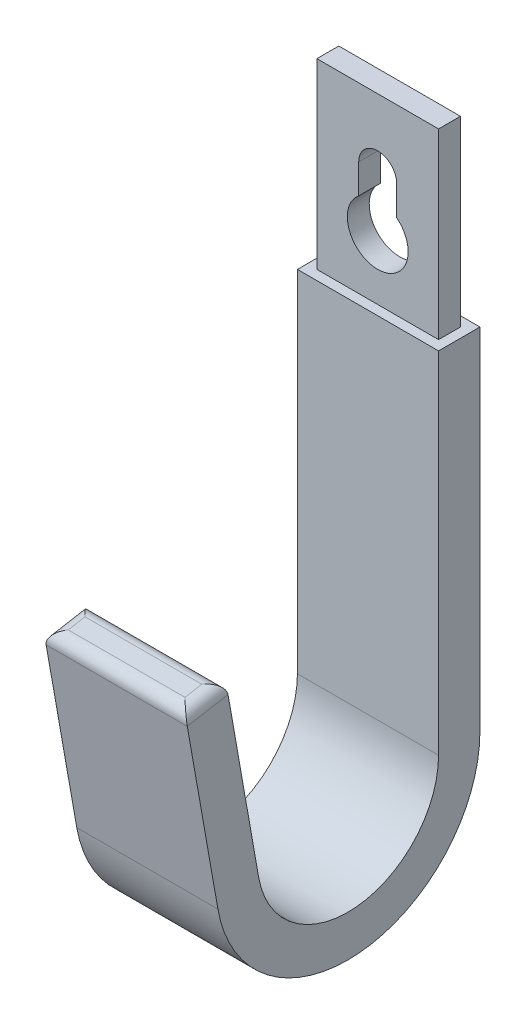
ISO-10303-21;
HEADER;
FILE_DESCRIPTION(('STEP AP214'),'2;1');
FILE_NAME('part.step','',(''),(''),'','','');
FILE_SCHEMA(('AUTOMOTIVE_DESIGN { 1 0 10303 214 1 1 1 1 }'));
ENDSEC;
DATA;
#1=APPLICATION_CONTEXT('core data for automotive mechanical design processes');
#2=APPLICATION_PROTOCOL_DEFINITION('international standard','automotive_design',2000,#1);
#3=PRODUCT_CONTEXT('',#1,'mechanical');
#4=PRODUCT('Part','Part','',(#3));
#5=PRODUCT_RELATED_PRODUCT_CATEGORY('part','',(#4));
#6=PRODUCT_DEFINITION_FORMATION('','',#4);
#7=PRODUCT_DEFINITION_CONTEXT('part definition',#1,'design');
#8=PRODUCT_DEFINITION('design','',#6,#7);
#9=PRODUCT_DEFINITION_SHAPE('','',#8);
#10=(LENGTH_UNIT() NAMED_UNIT(*) SI_UNIT(.MILLI.,.METRE.));
#11=(NAMED_UNIT(*) PLANE_ANGLE_UNIT() SI_UNIT($,.RADIAN.));
#12=(NAMED_UNIT(*) SI_UNIT($,.STERADIAN.) SOLID_ANGLE_UNIT());
#13=UNCERTAINTY_MEASURE_WITH_UNIT(LENGTH_MEASURE(1.E-05),#10,'distance_accuracy_value','');
#14=(GEOMETRIC_REPRESENTATION_CONTEXT(3) GLOBAL_UNCERTAINTY_ASSIGNED_CONTEXT((#13)) GLOBAL_UNIT_ASSIGNED_CONTEXT((#10,
#11,#12)) REPRESENTATION_CONTEXT('',''));
#15=CARTESIAN_POINT('',(0.,0.,0.));
#16=DIRECTION('',(0.,0.,1.));
#17=DIRECTION('',(1.,0.,0.));
#18=AXIS2_PLACEMENT_3D('',#15,#16,#17);
#19=CARTESIAN_POINT('',(-3.96875,96.9172401014875,-50.4386132870294));
#20=DIRECTION('',(-1.,0.,0.));
#21=DIRECTION('',(0.,-1.,0.));
#22=AXIS2_PLACEMENT_3D('',#19,#20,#21);
#23=PLANE('',#22);
#24=DIRECTION('',(0.,1.,0.));
#25=VECTOR('',#24,1.);
#26=CARTESIAN_POINT('',(-3.96875,96.9172401014875,-25.527));
#27=LINE('',#26,#25);
#28=CARTESIAN_POINT('',(-3.96875,90.7617072627162,-25.527));
#29=VERTEX_POINT('',#28);
#30=CARTESIAN_POINT('',(-3.96875,96.9172401014875,-25.527));
#31=VERTEX_POINT('',#30);
#32=EDGE_CURVE('E147',#29,#31,#27,.T.);
#33=ORIENTED_EDGE('',*,*,#32,.T.);
#34=DIRECTION('',(0.,0.,1.));
#35=VECTOR('',#34,1.);
#36=CARTESIAN_POINT('',(-3.96875,96.9172401014875,-50.4386132870294));
#37=LINE('',#36,#35);
#38=CARTESIAN_POINT('',(-3.96875,96.9172401014875,-20.955));
#39=VERTEX_POINT('',#38);
#40=EDGE_CURVE('E205',#31,#39,#37,.T.);
#41=ORIENTED_EDGE('',*,*,#40,.T.);
#42=DIRECTION('',(0.,-1.,0.));
#43=VECTOR('',#42,1.);
#44=CARTESIAN_POINT('',(-3.96875,96.9172401014875,-20.955));
#45=LINE('',#44,#43);
#46=CARTESIAN_POINT('',(-3.96875,90.7617072627162,-20.955));
#47=VERTEX_POINT('',#46);
#48=EDGE_CURVE('E197',#39,#47,#45,.T.);
#49=ORIENTED_EDGE('',*,*,#48,.T.);
#50=DIRECTION('',(0.,0.,1.));
#51=VECTOR('',#50,1.);
#52=CARTESIAN_POINT('',(-3.96875,90.7617072627162,-50.4386132870294));
#53=LINE('',#52,#51);
#54=EDGE_CURVE('E62',#29,#47,#53,.T.);
#55=ORIENTED_EDGE('',*,*,#54,.F.);
#56=EDGE_LOOP('',(#33,#41,#49,#55));
#57=FACE_BOUND('',#56,.T.);
#58=ADVANCED_FACE('F47',(#57),#23,.F.);
#59=CARTESIAN_POINT('',(0.,85.8047401014875,-50.4386132870294));
#60=DIRECTION('',(0.,0.,1.));
#61=DIRECTION('',(1.,0.,0.));
#62=AXIS2_PLACEMENT_3D('',#59,#60,#61);
#63=CYLINDRICAL_SURFACE('',#62,6.35);
#64=CARTESIAN_POINT('',(0.,85.8047401014875,-25.527));
#65=DIRECTION('',(0.,0.,1.));
#66=DIRECTION('',(1.,0.,0.));
#67=AXIS2_PLACEMENT_3D('',#64,#65,#66);
#68=CIRCLE('',#67,6.35);
#69=CARTESIAN_POINT('',(3.96875,90.7617072627162,-25.527));
#70=VERTEX_POINT('',#69);
#71=EDGE_CURVE('E189',#70,#29,#68,.F.);
#72=ORIENTED_EDGE('',*,*,#71,.T.);
#73=ORIENTED_EDGE('',*,*,#54,.T.);
#74=CARTESIAN_POINT('',(0.,85.8047401014875,-20.955));
#75=DIRECTION('',(0.,0.,1.));
#76=DIRECTION('',(1.,0.,0.));
#77=AXIS2_PLACEMENT_3D('',#74,#75,#76);
#78=CIRCLE('',#77,6.35);
#79=CARTESIAN_POINT('',(3.96875,90.7617072627162,-20.955));
#80=VERTEX_POINT('',#79);
#81=EDGE_CURVE('E199',#47,#80,#78,.T.);
#82=ORIENTED_EDGE('',*,*,#81,.T.);
#83=DIRECTION('',(0.,0.,1.));
#84=VECTOR('',#83,1.);
#85=CARTESIAN_POINT('',(3.96875,90.7617072627162,-50.4386132870294));
#86=LINE('',#85,#84);
#87=EDGE_CURVE('E207',#70,#80,#86,.T.);
#88=ORIENTED_EDGE('',*,*,#87,.F.);
#89=EDGE_LOOP('',(#72,#73,#82,#88));
#90=FACE_BOUND('',#89,.T.);
#91=ADVANCED_FACE('F262',(#90),#63,.F.);
#92=CARTESIAN_POINT('',(3.96875,96.9172401014875,-50.4386132870294));
#93=DIRECTION('',(1.,0.,0.));
#94=DIRECTION('',(0.,1.,0.));
#95=AXIS2_PLACEMENT_3D('',#92,#93,#94);
#96=PLANE('',#95);
#97=DIRECTION('',(0.,-1.,0.));
#98=VECTOR('',#97,1.);
#99=CARTESIAN_POINT('',(3.96875,96.9172401014875,-25.527));
#100=LINE('',#99,#98);
#101=CARTESIAN_POINT('',(3.96875,96.9172401014875,-25.527));
#102=VERTEX_POINT('',#101);
#103=EDGE_CURVE('E191',#102,#70,#100,.T.);
#104=ORIENTED_EDGE('',*,*,#103,.T.);
#105=ORIENTED_EDGE('',*,*,#87,.T.);
#106=DIRECTION('',(0.,1.,0.));
#107=VECTOR('',#106,1.);
#108=CARTESIAN_POINT('',(3.96875,96.9172401014875,-20.955));
#109=LINE('',#108,#107);
#110=CARTESIAN_POINT('',(3.96875,96.9172401014875,-20.955));
#111=VERTEX_POINT('',#110);
#112=EDGE_CURVE('E202',#80,#111,#109,.T.);
#113=ORIENTED_EDGE('',*,*,#112,.T.);
#114=DIRECTION('',(0.,0.,1.));
#115=VECTOR('',#114,1.);
#116=CARTESIAN_POINT('',(3.96875,96.9172401014875,-50.4386132870294));
#117=LINE('',#116,#115);
#118=EDGE_CURVE('E192',#102,#111,#117,.T.);
#119=ORIENTED_EDGE('',*,*,#118,.F.);
#120=EDGE_LOOP('',(#104,#105,#113,#119));
#121=FACE_BOUND('',#120,.T.);
#122=ADVANCED_FACE('F267',(#121),#96,.F.);
#123=CARTESIAN_POINT('',(0.,96.9172401014875,-50.4386132870294));
#124=DIRECTION('',(0.,0.,1.));
#125=DIRECTION('',(1.,0.,0.));
#126=AXIS2_PLACEMENT_3D('',#123,#124,#125);
#127=CYLINDRICAL_SURFACE('',#126,3.96875);
#128=CARTESIAN_POINT('',(0.,96.9172401014875,-25.527));
#129=DIRECTION('',(0.,0.,1.));
#130=DIRECTION('',(1.,0.,0.));
#131=AXIS2_PLACEMENT_3D('',#128,#129,#130);
#132=CIRCLE('',#131,3.96875);
#133=EDGE_CURVE('E194',#31,#102,#132,.F.);
#134=ORIENTED_EDGE('',*,*,#133,.T.);
#135=ORIENTED_EDGE('',*,*,#118,.T.);
#136=CARTESIAN_POINT('',(0.,96.9172401014875,-20.955));
#137=DIRECTION('',(0.,0.,1.));
#138=DIRECTION('',(1.,0.,0.));
#139=AXIS2_PLACEMENT_3D('',#136,#137,#138);
#140=CIRCLE('',#139,3.96875);
#141=EDGE_CURVE('E70',#111,#39,#140,.T.);
#142=ORIENTED_EDGE('',*,*,#141,.T.);
#143=ORIENTED_EDGE('',*,*,#40,.F.);
#144=EDGE_LOOP('',(#134,#135,#142,#143));
#145=FACE_BOUND('',#144,.T.);
#146=ADVANCED_FACE('F272',(#145),#127,.F.);
#147=CARTESIAN_POINT('',(12.7,111.204740101487,-20.955));
#148=DIRECTION('',(0.,1.,0.));
#149=DIRECTION('',(0.,0.,1.));
#150=AXIS2_PLACEMENT_3D('',#147,#148,#149);
#151=PLANE('',#150);
#152=DIRECTION('',(0.,0.,-1.));
#153=VECTOR('',#152,1.);
#154=CARTESIAN_POINT('',(-12.7,111.204740101487,-20.955));
#155=LINE('',#154,#153);
#156=CARTESIAN_POINT('',(-12.7,111.204740101487,-20.955));
#157=VERTEX_POINT('',#156);
#158=CARTESIAN_POINT('',(-12.7,111.204740101487,-25.527));
#159=VERTEX_POINT('',#158);
#160=EDGE_CURVE('E143',#157,#159,#155,.T.);
#161=ORIENTED_EDGE('',*,*,#160,.F.);
#162=DIRECTION('',(-1.,0.,0.));
#163=VECTOR('',#162,1.);
#164=CARTESIAN_POINT('',(12.7,111.204740101487,-20.955));
#165=LINE('',#164,#163);
#166=CARTESIAN_POINT('',(12.7,111.204740101487,-20.955));
#167=VERTEX_POINT('',#166);
#168=EDGE_CURVE('E55',#167,#157,#165,.T.);
#169=ORIENTED_EDGE('',*,*,#168,.F.);
#170=DIRECTION('',(0.,0.,-1.));
#171=VECTOR('',#170,1.);
#172=CARTESIAN_POINT('',(12.7,111.204740101487,-20.955));
#173=LINE('',#172,#171);
#174=CARTESIAN_POINT('',(12.7,111.204740101487,-25.527));
#175=VERTEX_POINT('',#174);
#176=EDGE_CURVE('E213',#167,#175,#173,.T.);
#177=ORIENTED_EDGE('',*,*,#176,.T.);
#178=DIRECTION('',(-1.,0.,0.));
#179=VECTOR('',#178,1.);
#180=CARTESIAN_POINT('',(12.7,111.204740101487,-25.527));
#181=LINE('',#180,#179);
#182=EDGE_CURVE('E13',#175,#159,#181,.T.);
#183=ORIENTED_EDGE('',*,*,#182,.T.);
#184=EDGE_LOOP('',(#161,#169,#177,#183));
#185=FACE_BOUND('',#184,.T.);
#186=ADVANCED_FACE('F229',(#185),#151,.T.);
#187=CARTESIAN_POINT('',(12.7,0.,-20.955));
#188=DIRECTION('',(0.,0.,1.));
#189=DIRECTION('',(1.,0.,0.));
#190=AXIS2_PLACEMENT_3D('',#187,#188,#189);
#191=PLANE('',#190);
#192=DIRECTION('',(0.,1.,0.));
#193=VECTOR('',#192,1.);
#194=CARTESIAN_POINT('',(-12.7,0.,-20.955));
#195=LINE('',#194,#193);
#196=CARTESIAN_POINT('',(-12.7,0.,-20.955));
#197=VERTEX_POINT('',#196);
#198=EDGE_CURVE('E214',#197,#157,#195,.T.);
#199=ORIENTED_EDGE('',*,*,#198,.F.);
#200=DIRECTION('',(-1.,0.,0.));
#201=VECTOR('',#200,1.);
#202=CARTESIAN_POINT('',(12.7,0.,-20.955));
#203=LINE('',#202,#201);
#204=CARTESIAN_POINT('',(12.7,0.,-20.955));
#205=VERTEX_POINT('',#204);
#206=EDGE_CURVE('E250',#205,#197,#203,.T.);
#207=ORIENTED_EDGE('',*,*,#206,.F.);
#208=DIRECTION('',(0.,1.,0.));
#209=VECTOR('',#208,1.);
#210=CARTESIAN_POINT('',(12.7,0.,-20.955));
#211=LINE('',#210,#209);
#212=EDGE_CURVE('E217',#205,#167,#211,.T.);
#213=ORIENTED_EDGE('',*,*,#212,.T.);
#214=ORIENTED_EDGE('',*,*,#168,.T.);
#215=EDGE_LOOP('',(#199,#207,#213,#214));
#216=FACE_BOUND('',#215,.T.);
#217=ORIENTED_EDGE('',*,*,#141,.F.);
#218=ORIENTED_EDGE('',*,*,#112,.F.);
#219=ORIENTED_EDGE('',*,*,#81,.F.);
#220=ORIENTED_EDGE('',*,*,#48,.F.);
#221=EDGE_LOOP('',(#217,#218,#219,#220));
#222=FACE_BOUND('',#221,.T.);
#223=ADVANCED_FACE('F223',(#216,#222),#191,.T.);
#224=CARTESIAN_POINT('',(12.7,0.,-25.527));
#225=DIRECTION('',(0.,0.,1.));
#226=DIRECTION('',(1.,0.,0.));
#227=AXIS2_PLACEMENT_3D('',#224,#225,#226);
#228=PLANE('',#227);
#229=ORIENTED_EDGE('',*,*,#103,.F.);
#230=ORIENTED_EDGE('',*,*,#133,.F.);
#231=ORIENTED_EDGE('',*,*,#32,.F.);
#232=ORIENTED_EDGE('',*,*,#71,.F.);
#233=EDGE_LOOP('',(#229,#230,#231,#232));
#234=FACE_BOUND('',#233,.T.);
#235=DIRECTION('',(0.,1.,0.));
#236=VECTOR('',#235,1.);
#237=CARTESIAN_POINT('',(12.7,0.,-25.527));
#238=LINE('',#237,#236);
#239=CARTESIAN_POINT('',(12.7,0.,-25.527));
#240=VERTEX_POINT('',#239);
#241=EDGE_CURVE('E160',#240,#175,#238,.T.);
#242=ORIENTED_EDGE('',*,*,#241,.F.);
#243=DIRECTION('',(-1.,0.,0.));
#244=VECTOR('',#243,1.);
#245=CARTESIAN_POINT('',(12.7,0.,-25.527));
#246=LINE('',#245,#244);
#247=CARTESIAN_POINT('',(-12.7,0.,-25.527));
#248=VERTEX_POINT('',#247);
#249=EDGE_CURVE('E154',#240,#248,#246,.T.);
#250=ORIENTED_EDGE('',*,*,#249,.T.);
#251=DIRECTION('',(0.,1.,0.));
#252=VECTOR('',#251,1.);
#253=CARTESIAN_POINT('',(-12.7,0.,-25.527));
#254=LINE('',#253,#252);
#255=EDGE_CURVE('E137',#248,#159,#254,.T.);
#256=ORIENTED_EDGE('',*,*,#255,.T.);
#257=ORIENTED_EDGE('',*,*,#182,.F.);
#258=EDGE_LOOP('',(#242,#250,#256,#257));
#259=FACE_BOUND('',#258,.T.);
#260=ADVANCED_FACE('F49',(#234,#259),#228,.F.);
#261=CARTESIAN_POINT('',(-12.7,0.,0.));
#262=DIRECTION('',(1.,0.,0.));
#263=DIRECTION('',(0.,0.,-1.));
#264=AXIS2_PLACEMENT_3D('',#261,#262,#263);
#265=PLANE('',#264);
#266=ORIENTED_EDGE('',*,*,#255,.F.);
#267=CARTESIAN_POINT('',(-12.7,0.,0.));
#268=DIRECTION('',(1.,0.,0.));
#269=DIRECTION('',(0.,0.,-1.));
#270=AXIS2_PLACEMENT_3D('',#267,#268,#269);
#271=CIRCLE('',#270,25.527);
#272=CARTESIAN_POINT('',(-12.7,-4.43271703130356,25.1391875111427));
#273=VERTEX_POINT('',#272);
#274=EDGE_CURVE('E141',#273,#248,#271,.T.);
#275=ORIENTED_EDGE('',*,*,#274,.F.);
#276=DIRECTION('',(0.,-0.984807753012209,-0.173648177666924));
#277=VECTOR('',#276,1.);
#278=CARTESIAN_POINT('',(-12.7,32.3058206331943,31.6171829331675));
#279=LINE('',#278,#277);
#280=CARTESIAN_POINT('',(-12.7,32.3058206331943,31.6171829331675));
#281=VERTEX_POINT('',#280);
#282=EDGE_CURVE('E157',#281,#273,#279,.T.);
#283=ORIENTED_EDGE('',*,*,#282,.F.);
#284=DIRECTION('',(0.,0.173648177666923,-0.984807753012209));
#285=VECTOR('',#284,1.);
#286=CARTESIAN_POINT('',(-12.7,32.3058206331943,31.6171829331675));
#287=LINE('',#286,#285);
#288=CARTESIAN_POINT('',(-12.7,33.0997401014875,27.1146418863957));
#289=VERTEX_POINT('',#288);
#290=EDGE_CURVE('E171',#281,#289,#287,.T.);
#291=ORIENTED_EDGE('',*,*,#290,.T.);
#292=DIRECTION('',(0.,-0.984807753012209,-0.173648177666924));
#293=VECTOR('',#292,1.);
#294=CARTESIAN_POINT('',(-12.7,33.0997401014875,27.1146418863957));
#295=LINE('',#294,#293);
#296=CARTESIAN_POINT('',(-12.7,-3.63879756301038,20.6366464643708));
#297=VERTEX_POINT('',#296);
#298=EDGE_CURVE('E174',#289,#297,#295,.T.);
#299=ORIENTED_EDGE('',*,*,#298,.T.);
#300=CARTESIAN_POINT('',(-12.7,0.,0.));
#301=DIRECTION('',(1.,0.,0.));
#302=DIRECTION('',(0.,0.,-1.));
#303=AXIS2_PLACEMENT_3D('',#300,#301,#302);
#304=CIRCLE('',#303,20.955);
#305=EDGE_CURVE('E177',#297,#197,#304,.T.);
#306=ORIENTED_EDGE('',*,*,#305,.T.);
#307=ORIENTED_EDGE('',*,*,#198,.T.);
#308=ORIENTED_EDGE('',*,*,#160,.T.);
#309=EDGE_LOOP('',(#266,#275,#283,#291,#299,#306,#307,#308));
#310=FACE_BOUND('',#309,.T.);
#311=ADVANCED_FACE('F139',(#310),#265,.F.);
#312=CARTESIAN_POINT('',(12.7,0.,0.));
#313=DIRECTION('',(1.,0.,0.));
#314=DIRECTION('',(0.,0.,-1.));
#315=AXIS2_PLACEMENT_3D('',#312,#313,#314);
#316=PLANE('',#315);
#317=ORIENTED_EDGE('',*,*,#212,.F.);
#318=CARTESIAN_POINT('',(12.7,0.,0.));
#319=DIRECTION('',(1.,0.,0.));
#320=DIRECTION('',(0.,0.,-1.));
#321=AXIS2_PLACEMENT_3D('',#318,#319,#320);
#322=CIRCLE('',#321,20.955);
#323=CARTESIAN_POINT('',(12.7,-3.63879756301038,20.6366464643708));
#324=VERTEX_POINT('',#323);
#325=EDGE_CURVE('E158',#324,#205,#322,.T.);
#326=ORIENTED_EDGE('',*,*,#325,.F.);
#327=DIRECTION('',(0.,-0.984807753012209,-0.173648177666924));
#328=VECTOR('',#327,1.);
#329=CARTESIAN_POINT('',(12.7,33.0997401014875,27.1146418863957));
#330=LINE('',#329,#328);
#331=CARTESIAN_POINT('',(12.7,33.0997401014875,27.1146418863957));
#332=VERTEX_POINT('',#331);
#333=EDGE_CURVE('E184',#332,#324,#330,.T.);
#334=ORIENTED_EDGE('',*,*,#333,.F.);
#335=DIRECTION('',(0.,0.173648177666923,-0.984807753012209));
#336=VECTOR('',#335,1.);
#337=CARTESIAN_POINT('',(12.7,32.3058206331943,31.6171829331675));
#338=LINE('',#337,#336);
#339=CARTESIAN_POINT('',(12.7,32.3058206331943,31.6171829331675));
#340=VERTEX_POINT('',#339);
#341=EDGE_CURVE('E181',#340,#332,#338,.T.);
#342=ORIENTED_EDGE('',*,*,#341,.F.);
#343=DIRECTION('',(0.,-0.984807753012209,-0.173648177666924));
#344=VECTOR('',#343,1.);
#345=CARTESIAN_POINT('',(12.7,32.3058206331943,31.6171829331675));
#346=LINE('',#345,#344);
#347=CARTESIAN_POINT('',(12.7,-4.43271703130356,25.1391875111427));
#348=VERTEX_POINT('',#347);
#349=EDGE_CURVE('E164',#340,#348,#346,.T.);
#350=ORIENTED_EDGE('',*,*,#349,.T.);
#351=CARTESIAN_POINT('',(12.7,0.,0.));
#352=DIRECTION('',(1.,0.,0.));
#353=DIRECTION('',(0.,0.,-1.));
#354=AXIS2_PLACEMENT_3D('',#351,#352,#353);
#355=CIRCLE('',#354,25.527);
#356=EDGE_CURVE('E162',#348,#240,#355,.T.);
#357=ORIENTED_EDGE('',*,*,#356,.T.);
#358=ORIENTED_EDGE('',*,*,#241,.T.);
#359=ORIENTED_EDGE('',*,*,#176,.F.);
#360=EDGE_LOOP('',(#317,#326,#334,#342,#350,#357,#358,#359));
#361=FACE_BOUND('',#360,.T.);
#362=ADVANCED_FACE('F231',(#361),#316,.T.);
#363=CARTESIAN_POINT('',(12.7,0.,0.));
#364=DIRECTION('',(-1.,0.,0.));
#365=DIRECTION('',(0.,0.,1.));
#366=AXIS2_PLACEMENT_3D('',#363,#364,#365);
#367=CYLINDRICAL_SURFACE('',#366,20.955);
#368=ORIENTED_EDGE('',*,*,#305,.F.);
#369=DIRECTION('',(-1.,0.,0.));
#370=VECTOR('',#369,1.);
#371=CARTESIAN_POINT('',(12.7,-3.63879756301038,20.6366464643708));
#372=LINE('',#371,#370);
#373=EDGE_CURVE('E244',#324,#297,#372,.T.);
#374=ORIENTED_EDGE('',*,*,#373,.F.);
#375=ORIENTED_EDGE('',*,*,#325,.T.);
#376=ORIENTED_EDGE('',*,*,#206,.T.);
#377=EDGE_LOOP('',(#368,#374,#375,#376));
#378=FACE_BOUND('',#377,.T.);
#379=ADVANCED_FACE('F249',(#378),#367,.F.);
#380=CARTESIAN_POINT('',(12.7,33.0997401014875,27.1146418863957));
#381=DIRECTION('',(0.,0.173648177666924,-0.984807753012209));
#382=DIRECTION('',(0.,0.984807753012209,0.173648177666924));
#383=AXIS2_PLACEMENT_3D('',#380,#381,#382);
#384=PLANE('',#383);
#385=ORIENTED_EDGE('',*,*,#298,.F.);
#386=DIRECTION('',(-1.,0.,0.));
#387=VECTOR('',#386,1.);
#388=CARTESIAN_POINT('',(12.7,33.0997401014875,27.1146418863957));
#389=LINE('',#388,#387);
#390=EDGE_CURVE('E241',#332,#289,#389,.T.);
#391=ORIENTED_EDGE('',*,*,#390,.F.);
#392=ORIENTED_EDGE('',*,*,#333,.T.);
#393=ORIENTED_EDGE('',*,*,#373,.T.);
#394=EDGE_LOOP('',(#385,#391,#392,#393));
#395=FACE_BOUND('',#394,.T.);
#396=ADVANCED_FACE('F246',(#395),#384,.T.);
#397=CARTESIAN_POINT('',(12.7,32.3058206331943,31.6171829331675));
#398=DIRECTION('',(0.,0.984807753012209,0.173648177666923));
#399=DIRECTION('',(0.,-0.173648177666923,0.984807753012209));
#400=AXIS2_PLACEMENT_3D('',#397,#398,#399);
#401=PLANE('',#400);
#402=ORIENTED_EDGE('',*,*,#290,.F.);
#403=DIRECTION('',(-1.,0.,0.));
#404=VECTOR('',#403,1.);
#405=CARTESIAN_POINT('',(12.7,32.3058206331943,31.6171829331675));
#406=LINE('',#405,#404);
#407=EDGE_CURVE('E166',#340,#281,#406,.T.);
#408=ORIENTED_EDGE('',*,*,#407,.F.);
#409=ORIENTED_EDGE('',*,*,#341,.T.);
#410=ORIENTED_EDGE('',*,*,#390,.T.);
#411=EDGE_LOOP('',(#402,#408,#409,#410));
#412=FACE_BOUND('',#411,.T.);
#413=ADVANCED_FACE('F240',(#412),#401,.T.);
#414=CARTESIAN_POINT('',(12.7,32.3058206331943,31.6171829331675));
#415=DIRECTION('',(0.,0.173648177666924,-0.984807753012209));
#416=DIRECTION('',(0.,0.984807753012209,0.173648177666924));
#417=AXIS2_PLACEMENT_3D('',#414,#415,#416);
#418=PLANE('',#417);
#419=ORIENTED_EDGE('',*,*,#282,.T.);
#420=DIRECTION('',(-1.,0.,0.));
#421=VECTOR('',#420,1.);
#422=CARTESIAN_POINT('',(12.7,-4.43271703130356,25.1391875111427));
#423=LINE('',#422,#421);
#424=EDGE_CURVE('E156',#348,#273,#423,.T.);
#425=ORIENTED_EDGE('',*,*,#424,.F.);
#426=ORIENTED_EDGE('',*,*,#349,.F.);
#427=ORIENTED_EDGE('',*,*,#407,.T.);
#428=EDGE_LOOP('',(#419,#425,#426,#427));
#429=FACE_BOUND('',#428,.T.);
#430=ADVANCED_FACE('F237',(#429),#418,.F.);
#431=CARTESIAN_POINT('',(12.7,0.,0.));
#432=DIRECTION('',(-1.,0.,0.));
#433=DIRECTION('',(0.,0.,1.));
#434=AXIS2_PLACEMENT_3D('',#431,#432,#433);
#435=CYLINDRICAL_SURFACE('',#434,25.527);
#436=ORIENTED_EDGE('',*,*,#274,.T.);
#437=ORIENTED_EDGE('',*,*,#249,.F.);
#438=ORIENTED_EDGE('',*,*,#356,.F.);
#439=ORIENTED_EDGE('',*,*,#424,.T.);
#440=EDGE_LOOP('',(#436,#437,#438,#439));
#441=FACE_BOUND('',#440,.T.);
#442=ADVANCED_FACE('F152',(#441),#435,.T.);
#443=CLOSED_SHELL('',(#58,#91,#122,#146,#186,#223,#260,#311,#362,#379,#396,#413,#430,#442));
#444=MANIFOLD_SOLID_BREP('B2',#443);
#445=CARTESIAN_POINT('',(0.,73.1047401014875,0.));
#446=DIRECTION('',(0.,1.,0.));
#447=DIRECTION('',(0.,0.,1.));
#448=AXIS2_PLACEMENT_3D('',#445,#446,#447);
#449=PLANE('',#448);
#450=DIRECTION('',(0.,0.,1.));
#451=VECTOR('',#450,1.);
#452=CARTESIAN_POINT('',(14.732,73.1047401014875,0.));
#453=LINE('',#452,#451);
#454=CARTESIAN_POINT('',(14.732,73.1047401014875,-27.559));
#455=VERTEX_POINT('',#454);
#456=CARTESIAN_POINT('',(14.732,73.1047401014875,-18.923));
#457=VERTEX_POINT('',#456);
#458=EDGE_CURVE('E581',#455,#457,#453,.T.);
#459=ORIENTED_EDGE('',*,*,#458,.F.);
#460=DIRECTION('',(-1.,0.,0.));
#461=VECTOR('',#460,1.);
#462=CARTESIAN_POINT('',(12.7,73.1047401014875,-27.559));
#463=LINE('',#462,#461);
#464=CARTESIAN_POINT('',(-14.732,73.1047401014875,-27.559));
#465=VERTEX_POINT('',#464);
#466=EDGE_CURVE('E593',#455,#465,#463,.T.);
#467=ORIENTED_EDGE('',*,*,#466,.T.);
#468=DIRECTION('',(0.,0.,1.));
#469=VECTOR('',#468,1.);
#470=CARTESIAN_POINT('',(-14.732,73.1047401014875,0.));
#471=LINE('',#470,#469);
#472=CARTESIAN_POINT('',(-14.732,73.1047401014875,-18.923));
#473=VERTEX_POINT('',#472);
#474=EDGE_CURVE('E526',#465,#473,#471,.T.);
#475=ORIENTED_EDGE('',*,*,#474,.T.);
#476=DIRECTION('',(-1.,0.,0.));
#477=VECTOR('',#476,1.);
#478=CARTESIAN_POINT('',(12.7,73.1047401014875,-18.923));
#479=LINE('',#478,#477);
#480=EDGE_CURVE('E596',#457,#473,#479,.T.);
#481=ORIENTED_EDGE('',*,*,#480,.F.);
#482=EDGE_LOOP('',(#459,#467,#475,#481));
#483=FACE_BOUND('',#482,.T.);
#484=DIRECTION('',(-1.,0.,0.));
#485=VECTOR('',#484,1.);
#486=CARTESIAN_POINT('',(12.7,73.1047401014875,-25.527));
#487=LINE('',#486,#485);
#488=CARTESIAN_POINT('',(12.7,73.1047401014875,-25.527));
#489=VERTEX_POINT('',#488);
#490=CARTESIAN_POINT('',(-12.7,73.1047401014875,-25.527));
#491=VERTEX_POINT('',#490);
#492=EDGE_CURVE('E531',#489,#491,#487,.T.);
#493=ORIENTED_EDGE('',*,*,#492,.F.);
#494=DIRECTION('',(0.,0.,1.));
#495=VECTOR('',#494,1.);
#496=CARTESIAN_POINT('',(12.7,73.1047401014875,0.));
#497=LINE('',#496,#495);
#498=CARTESIAN_POINT('',(12.7,73.1047401014875,-20.955));
#499=VERTEX_POINT('',#498);
#500=EDGE_CURVE('E739',#489,#499,#497,.T.);
#501=ORIENTED_EDGE('',*,*,#500,.T.);
#502=DIRECTION('',(-1.,0.,0.));
#503=VECTOR('',#502,1.);
#504=CARTESIAN_POINT('',(12.7,73.1047401014875,-20.955));
#505=LINE('',#504,#503);
#506=CARTESIAN_POINT('',(-12.7,73.1047401014875,-20.955));
#507=VERTEX_POINT('',#506);
#508=EDGE_CURVE('E537',#499,#507,#505,.T.);
#509=ORIENTED_EDGE('',*,*,#508,.T.);
#510=DIRECTION('',(0.,0.,1.));
#511=VECTOR('',#510,1.);
#512=CARTESIAN_POINT('',(-12.7,73.1047401014875,0.));
#513=LINE('',#512,#511);
#514=EDGE_CURVE('E519',#491,#507,#513,.T.);
#515=ORIENTED_EDGE('',*,*,#514,.F.);
#516=EDGE_LOOP('',(#493,#501,#509,#515));
#517=FACE_BOUND('',#516,.T.);
#518=ADVANCED_FACE('F389',(#483,#517),#449,.T.);
#519=CARTESIAN_POINT('',(12.7,0.,-27.559));
#520=DIRECTION('',(0.,0.,1.));
#521=DIRECTION('',(1.,0.,0.));
#522=AXIS2_PLACEMENT_3D('',#519,#520,#521);
#523=PLANE('',#522);
#524=ORIENTED_EDGE('',*,*,#466,.F.);
#525=DIRECTION('',(0.,1.,0.));
#526=VECTOR('',#525,1.);
#527=CARTESIAN_POINT('',(14.732,0.,-27.559));
#528=LINE('',#527,#526);
#529=CARTESIAN_POINT('',(14.732,0.,-27.559));
#530=VERTEX_POINT('',#529);
#531=EDGE_CURVE('E552',#530,#455,#528,.T.);
#532=ORIENTED_EDGE('',*,*,#531,.F.);
#533=DIRECTION('',(1.,0.,0.));
#534=VECTOR('',#533,1.);
#535=CARTESIAN_POINT('',(12.7,0.,-27.559));
#536=LINE('',#535,#534);
#537=CARTESIAN_POINT('',(-14.732,0.,-27.559));
#538=VERTEX_POINT('',#537);
#539=EDGE_CURVE('E557',#530,#538,#536,.F.);
#540=ORIENTED_EDGE('',*,*,#539,.T.);
#541=DIRECTION('',(0.,1.,0.));
#542=VECTOR('',#541,1.);
#543=CARTESIAN_POINT('',(-14.732,0.,-27.559));
#544=LINE('',#543,#542);
#545=EDGE_CURVE('E562',#538,#465,#544,.T.);
#546=ORIENTED_EDGE('',*,*,#545,.T.);
#547=EDGE_LOOP('',(#524,#532,#540,#546));
#548=FACE_BOUND('',#547,.T.);
#549=ADVANCED_FACE('F662',(#548),#523,.F.);
#550=CARTESIAN_POINT('',(12.7,0.,-18.923));
#551=DIRECTION('',(0.,0.,1.));
#552=DIRECTION('',(1.,0.,0.));
#553=AXIS2_PLACEMENT_3D('',#550,#551,#552);
#554=PLANE('',#553);
#555=DIRECTION('',(0.,1.,0.));
#556=VECTOR('',#555,1.);
#557=CARTESIAN_POINT('',(14.732,0.,-18.923));
#558=LINE('',#557,#556);
#559=CARTESIAN_POINT('',(14.732,0.,-18.923));
#560=VERTEX_POINT('',#559);
#561=EDGE_CURVE('E556',#560,#457,#558,.T.);
#562=ORIENTED_EDGE('',*,*,#561,.T.);
#563=ORIENTED_EDGE('',*,*,#480,.T.);
#564=DIRECTION('',(0.,1.,0.));
#565=VECTOR('',#564,1.);
#566=CARTESIAN_POINT('',(-14.732,0.,-18.923));
#567=LINE('',#566,#565);
#568=CARTESIAN_POINT('',(-14.732,0.,-18.923));
#569=VERTEX_POINT('',#568);
#570=EDGE_CURVE('E565',#569,#473,#567,.T.);
#571=ORIENTED_EDGE('',*,*,#570,.F.);
#572=DIRECTION('',(-1.,0.,0.));
#573=VECTOR('',#572,1.);
#574=CARTESIAN_POINT('',(12.7,0.,-18.923));
#575=LINE('',#574,#573);
#576=EDGE_CURVE('E578',#560,#569,#575,.T.);
#577=ORIENTED_EDGE('',*,*,#576,.F.);
#578=EDGE_LOOP('',(#562,#563,#571,#577));
#579=FACE_BOUND('',#578,.T.);
#580=ADVANCED_FACE('F665',(#579),#554,.T.);
#581=CARTESIAN_POINT('',(14.732,0.,0.));
#582=DIRECTION('',(1.,0.,0.));
#583=DIRECTION('',(0.,0.,-1.));
#584=AXIS2_PLACEMENT_3D('',#581,#582,#583);
#585=PLANE('',#584);
#586=DIRECTION('',(0.,-0.984807753012209,-0.173648177666924));
#587=VECTOR('',#586,1.);
#588=CARTESIAN_POINT('',(14.732,33.4525931985067,25.1135125322749));
#589=LINE('',#588,#587);
#590=CARTESIAN_POINT('',(14.732,32.9523108599764,25.0252992580201));
#591=VERTEX_POINT('',#590);
#592=CARTESIAN_POINT('',(14.732,-3.28594446599119,18.63551711025));
#593=VERTEX_POINT('',#592);
#594=EDGE_CURVE('E571',#591,#593,#589,.T.);
#595=ORIENTED_EDGE('',*,*,#594,.F.);
#596=DIRECTION('',(0.,0.173648177666923,-0.984807753012209));
#597=VECTOR('',#596,1.);
#598=CARTESIAN_POINT('',(14.732,36.2382553259676,6.38978214777005));
#599=LINE('',#598,#597);
#600=CARTESIAN_POINT('',(14.732,31.4526851976449,33.5300990130335));
#601=VERTEX_POINT('',#600);
#602=EDGE_CURVE('E413',#591,#601,#599,.F.);
#603=ORIENTED_EDGE('',*,*,#602,.T.);
#604=DIRECTION('',(0.,-0.984807753012209,-0.173648177666924));
#605=VECTOR('',#604,1.);
#606=CARTESIAN_POINT('',(14.732,31.9529675361751,33.6183122872883));
#607=LINE('',#606,#605);
#608=CARTESIAN_POINT('',(14.732,-4.78557012832274,27.1403168652635));
#609=VERTEX_POINT('',#608);
#610=EDGE_CURVE('E573',#601,#609,#607,.T.);
#611=ORIENTED_EDGE('',*,*,#610,.T.);
#612=CARTESIAN_POINT('',(14.732,0.,0.));
#613=DIRECTION('',(1.,0.,0.));
#614=DIRECTION('',(0.,0.,-1.));
#615=AXIS2_PLACEMENT_3D('',#612,#613,#614);
#616=CIRCLE('',#615,27.559);
#617=EDGE_CURVE('E560',#609,#530,#616,.T.);
#618=ORIENTED_EDGE('',*,*,#617,.T.);
#619=ORIENTED_EDGE('',*,*,#531,.T.);
#620=ORIENTED_EDGE('',*,*,#458,.T.);
#621=ORIENTED_EDGE('',*,*,#561,.F.);
#622=CARTESIAN_POINT('',(14.732,0.,0.));
#623=DIRECTION('',(1.,0.,0.));
#624=DIRECTION('',(0.,0.,-1.));
#625=AXIS2_PLACEMENT_3D('',#622,#623,#624);
#626=CIRCLE('',#625,18.923);
#627=EDGE_CURVE('E568',#593,#560,#626,.T.);
#628=ORIENTED_EDGE('',*,*,#627,.F.);
#629=EDGE_LOOP('',(#595,#603,#611,#618,#619,#620,#621,#628));
#630=FACE_BOUND('',#629,.T.);
#631=ADVANCED_FACE('F641',(#630),#585,.T.);
#632=CARTESIAN_POINT('',(-14.732,0.,0.));
#633=DIRECTION('',(1.,0.,0.));
#634=DIRECTION('',(0.,0.,-1.));
#635=AXIS2_PLACEMENT_3D('',#632,#633,#634);
#636=PLANE('',#635);
#637=DIRECTION('',(0.,-0.984807753012209,-0.173648177666924));
#638=VECTOR('',#637,1.);
#639=CARTESIAN_POINT('',(-14.732,31.9529675361751,33.6183122872883));
#640=LINE('',#639,#638);
#641=CARTESIAN_POINT('',(-14.732,31.4526851976449,33.5300990130335));
#642=VERTEX_POINT('',#641);
#643=CARTESIAN_POINT('',(-14.732,-4.78557012832274,27.1403168652635));
#644=VERTEX_POINT('',#643);
#645=EDGE_CURVE('E583',#642,#644,#640,.T.);
#646=ORIENTED_EDGE('',*,*,#645,.F.);
#647=DIRECTION('',(0.,0.173648177666923,-0.984807753012209));
#648=VECTOR('',#647,1.);
#649=CARTESIAN_POINT('',(-14.732,32.9523108599764,25.0252992580201));
#650=LINE('',#649,#648);
#651=CARTESIAN_POINT('',(-14.732,32.9523108599764,25.0252992580201));
#652=VERTEX_POINT('',#651);
#653=EDGE_CURVE('E45',#642,#652,#650,.T.);
#654=ORIENTED_EDGE('',*,*,#653,.T.);
#655=DIRECTION('',(0.,-0.984807753012209,-0.173648177666924));
#656=VECTOR('',#655,1.);
#657=CARTESIAN_POINT('',(-14.732,33.4525931985067,25.1135125322749));
#658=LINE('',#657,#656);
#659=CARTESIAN_POINT('',(-14.732,-3.28594446599119,18.63551711025));
#660=VERTEX_POINT('',#659);
#661=EDGE_CURVE('E585',#652,#660,#658,.T.);
#662=ORIENTED_EDGE('',*,*,#661,.T.);
#663=CARTESIAN_POINT('',(-14.732,0.,0.));
#664=DIRECTION('',(1.,0.,0.));
#665=DIRECTION('',(0.,0.,-1.));
#666=AXIS2_PLACEMENT_3D('',#663,#664,#665);
#667=CIRCLE('',#666,18.923);
#668=EDGE_CURVE('E577',#660,#569,#667,.T.);
#669=ORIENTED_EDGE('',*,*,#668,.T.);
#670=ORIENTED_EDGE('',*,*,#570,.T.);
#671=ORIENTED_EDGE('',*,*,#474,.F.);
#672=ORIENTED_EDGE('',*,*,#545,.F.);
#673=CARTESIAN_POINT('',(-14.732,0.,0.));
#674=DIRECTION('',(1.,0.,0.));
#675=DIRECTION('',(0.,0.,-1.));
#676=AXIS2_PLACEMENT_3D('',#673,#674,#675);
#677=CIRCLE('',#676,27.559);
#678=EDGE_CURVE('E555',#644,#538,#677,.T.);
#679=ORIENTED_EDGE('',*,*,#678,.F.);
#680=EDGE_LOOP('',(#646,#654,#662,#669,#670,#671,#672,#679));
#681=FACE_BOUND('',#680,.T.);
#682=ADVANCED_FACE('F648',(#681),#636,.F.);
#683=CARTESIAN_POINT('',(12.7,0.,0.));
#684=DIRECTION('',(-1.,0.,0.));
#685=DIRECTION('',(0.,0.,1.));
#686=AXIS2_PLACEMENT_3D('',#683,#684,#685);
#687=CYLINDRICAL_SURFACE('',#686,18.923);
#688=ORIENTED_EDGE('',*,*,#668,.F.);
#689=DIRECTION('',(1.,0.,0.));
#690=VECTOR('',#689,1.);
#691=CARTESIAN_POINT('',(12.7,-3.28594446599119,18.63551711025));
#692=LINE('',#691,#690);
#693=EDGE_CURVE('E580',#593,#660,#692,.F.);
#694=ORIENTED_EDGE('',*,*,#693,.F.);
#695=ORIENTED_EDGE('',*,*,#627,.T.);
#696=ORIENTED_EDGE('',*,*,#576,.T.);
#697=EDGE_LOOP('',(#688,#694,#695,#696));
#698=FACE_BOUND('',#697,.T.);
#699=ADVANCED_FACE('F645',(#698),#687,.F.);
#700=CARTESIAN_POINT('',(12.7,33.4525931985067,25.1135125322749));
#701=DIRECTION('',(0.,0.173648177666924,-0.984807753012209));
#702=DIRECTION('',(0.,0.984807753012209,0.173648177666924));
#703=AXIS2_PLACEMENT_3D('',#700,#701,#702);
#704=PLANE('',#703);
#705=ORIENTED_EDGE('',*,*,#661,.F.);
#706=DIRECTION('',(-1.,0.,0.));
#707=VECTOR('',#706,1.);
#708=CARTESIAN_POINT('',(12.7,32.9523108599765,25.0252992580201));
#709=LINE('',#708,#707);
#710=EDGE_CURVE('E610',#652,#591,#709,.F.);
#711=ORIENTED_EDGE('',*,*,#710,.T.);
#712=ORIENTED_EDGE('',*,*,#594,.T.);
#713=ORIENTED_EDGE('',*,*,#693,.T.);
#714=EDGE_LOOP('',(#705,#711,#712,#713));
#715=FACE_BOUND('',#714,.T.);
#716=ADVANCED_FACE('F638',(#715),#704,.T.);
#717=CARTESIAN_POINT('',(12.7,34.3069499873151,31.9700360301867));
#718=DIRECTION('',(0.,0.984807753012209,0.173648177666923));
#719=DIRECTION('',(0.,-0.173648177666923,0.984807753012209));
#720=AXIS2_PLACEMENT_3D('',#717,#718,#719);
#721=PLANE('',#720);
#722=DIRECTION('',(0.,0.173648177666923,-0.984807753012209));
#723=VECTOR('',#722,1.);
#724=CARTESIAN_POINT('',(12.192,34.3069499873151,31.9700360301867));
#725=LINE('',#724,#723);
#726=CARTESIAN_POINT('',(12.192,34.3951632615699,31.4697536916565));
#727=VERTEX_POINT('',#726);
#728=CARTESIAN_POINT('',(12.192,35.0126561813535,27.9677773219451));
#729=VERTEX_POINT('',#728);
#730=EDGE_CURVE('E605',#727,#729,#725,.T.);
#731=ORIENTED_EDGE('',*,*,#730,.T.);
#732=DIRECTION('',(-1.,0.,0.));
#733=VECTOR('',#732,1.);
#734=CARTESIAN_POINT('',(12.7,35.0126561813535,27.9677773219451));
#735=LINE('',#734,#733);
#736=CARTESIAN_POINT('',(-12.192,35.0126561813535,27.9677773219451));
#737=VERTEX_POINT('',#736);
#738=EDGE_CURVE('E607',#729,#737,#735,.T.);
#739=ORIENTED_EDGE('',*,*,#738,.T.);
#740=DIRECTION('',(0.,0.173648177666923,-0.984807753012209));
#741=VECTOR('',#740,1.);
#742=CARTESIAN_POINT('',(-12.192,33.9540968902959,33.9711653843075));
#743=LINE('',#742,#741);
#744=CARTESIAN_POINT('',(-12.192,34.3951632615699,31.4697536916565));
#745=VERTEX_POINT('',#744);
#746=EDGE_CURVE('E564',#737,#745,#743,.F.);
#747=ORIENTED_EDGE('',*,*,#746,.T.);
#748=DIRECTION('',(-1.,0.,0.));
#749=VECTOR('',#748,1.);
#750=CARTESIAN_POINT('',(14.732,34.3951632615699,31.4697536916565));
#751=LINE('',#750,#749);
#752=EDGE_CURVE('E603',#745,#727,#751,.F.);
#753=ORIENTED_EDGE('',*,*,#752,.T.);
#754=EDGE_LOOP('',(#731,#739,#747,#753));
#755=FACE_BOUND('',#754,.T.);
#756=ADVANCED_FACE('F630',(#755),#721,.T.);
#757=CARTESIAN_POINT('',(12.7,31.9529675361751,33.6183122872883));
#758=DIRECTION('',(0.,0.173648177666924,-0.984807753012209));
#759=DIRECTION('',(0.,0.984807753012209,0.173648177666924));
#760=AXIS2_PLACEMENT_3D('',#757,#758,#759);
#761=PLANE('',#760);
#762=ORIENTED_EDGE('',*,*,#610,.F.);
#763=DIRECTION('',(-1.,0.,0.));
#764=VECTOR('',#763,1.);
#765=CARTESIAN_POINT('',(-14.732,31.4526851976449,33.5300990130335));
#766=LINE('',#765,#764);
#767=EDGE_CURVE('E398',#601,#642,#766,.T.);
#768=ORIENTED_EDGE('',*,*,#767,.T.);
#769=ORIENTED_EDGE('',*,*,#645,.T.);
#770=DIRECTION('',(-1.,0.,0.));
#771=VECTOR('',#770,1.);
#772=CARTESIAN_POINT('',(12.7,-4.78557012832274,27.1403168652635));
#773=LINE('',#772,#771);
#774=EDGE_CURVE('E561',#609,#644,#773,.T.);
#775=ORIENTED_EDGE('',*,*,#774,.F.);
#776=EDGE_LOOP('',(#762,#768,#769,#775));
#777=FACE_BOUND('',#776,.T.);
#778=ADVANCED_FACE('F653',(#777),#761,.F.);
#779=CARTESIAN_POINT('',(12.7,0.,0.));
#780=DIRECTION('',(-1.,0.,0.));
#781=DIRECTION('',(0.,0.,1.));
#782=AXIS2_PLACEMENT_3D('',#779,#780,#781);
#783=CYLINDRICAL_SURFACE('',#782,27.559);
#784=ORIENTED_EDGE('',*,*,#678,.T.);
#785=ORIENTED_EDGE('',*,*,#539,.F.);
#786=ORIENTED_EDGE('',*,*,#617,.F.);
#787=ORIENTED_EDGE('',*,*,#774,.T.);
#788=EDGE_LOOP('',(#784,#785,#786,#787));
#789=FACE_BOUND('',#788,.T.);
#790=ADVANCED_FACE('F656',(#789),#783,.T.);
#791=CARTESIAN_POINT('',(12.7,0.,-25.527));
#792=DIRECTION('',(0.,0.,1.));
#793=DIRECTION('',(1.,0.,0.));
#794=AXIS2_PLACEMENT_3D('',#791,#792,#793);
#795=PLANE('',#794);
#796=ORIENTED_EDGE('',*,*,#492,.T.);
#797=DIRECTION('',(0.,1.,0.));
#798=VECTOR('',#797,1.);
#799=CARTESIAN_POINT('',(-12.7,0.,-25.527));
#800=LINE('',#799,#798);
#801=CARTESIAN_POINT('',(-12.7,0.,-25.527));
#802=VERTEX_POINT('',#801);
#803=EDGE_CURVE('E514',#802,#491,#800,.T.);
#804=ORIENTED_EDGE('',*,*,#803,.F.);
#805=DIRECTION('',(-1.,0.,0.));
#806=VECTOR('',#805,1.);
#807=CARTESIAN_POINT('',(12.7,0.,-25.527));
#808=LINE('',#807,#806);
#809=CARTESIAN_POINT('',(12.7,0.,-25.527));
#810=VERTEX_POINT('',#809);
#811=EDGE_CURVE('E729',#810,#802,#808,.T.);
#812=ORIENTED_EDGE('',*,*,#811,.F.);
#813=DIRECTION('',(0.,1.,0.));
#814=VECTOR('',#813,1.);
#815=CARTESIAN_POINT('',(12.7,0.,-25.527));
#816=LINE('',#815,#814);
#817=EDGE_CURVE('E534',#810,#489,#816,.T.);
#818=ORIENTED_EDGE('',*,*,#817,.T.);
#819=EDGE_LOOP('',(#796,#804,#812,#818));
#820=FACE_BOUND('',#819,.T.);
#821=ADVANCED_FACE('F532',(#820),#795,.T.);
#822=CARTESIAN_POINT('',(12.7,0.,-20.955));
#823=DIRECTION('',(0.,0.,1.));
#824=DIRECTION('',(1.,0.,0.));
#825=AXIS2_PLACEMENT_3D('',#822,#823,#824);
#826=PLANE('',#825);
#827=DIRECTION('',(0.,1.,0.));
#828=VECTOR('',#827,1.);
#829=CARTESIAN_POINT('',(12.7,0.,-20.955));
#830=LINE('',#829,#828);
#831=CARTESIAN_POINT('',(12.7,0.,-20.955));
#832=VERTEX_POINT('',#831);
#833=EDGE_CURVE('E545',#832,#499,#830,.T.);
#834=ORIENTED_EDGE('',*,*,#833,.F.);
#835=DIRECTION('',(-1.,0.,0.));
#836=VECTOR('',#835,1.);
#837=CARTESIAN_POINT('',(12.7,0.,-20.955));
#838=LINE('',#837,#836);
#839=CARTESIAN_POINT('',(-12.7,0.,-20.955));
#840=VERTEX_POINT('',#839);
#841=EDGE_CURVE('E715',#832,#840,#838,.T.);
#842=ORIENTED_EDGE('',*,*,#841,.T.);
#843=DIRECTION('',(0.,1.,0.));
#844=VECTOR('',#843,1.);
#845=CARTESIAN_POINT('',(-12.7,0.,-20.955));
#846=LINE('',#845,#844);
#847=EDGE_CURVE('E527',#840,#507,#846,.T.);
#848=ORIENTED_EDGE('',*,*,#847,.T.);
#849=ORIENTED_EDGE('',*,*,#508,.F.);
#850=EDGE_LOOP('',(#834,#842,#848,#849));
#851=FACE_BOUND('',#850,.T.);
#852=ADVANCED_FACE('F682',(#851),#826,.F.);
#853=CARTESIAN_POINT('',(12.7,0.,0.));
#854=DIRECTION('',(1.,0.,0.));
#855=DIRECTION('',(0.,0.,-1.));
#856=AXIS2_PLACEMENT_3D('',#853,#854,#855);
#857=PLANE('',#856);
#858=ORIENTED_EDGE('',*,*,#817,.F.);
#859=CARTESIAN_POINT('',(12.7,0.,0.));
#860=DIRECTION('',(1.,0.,0.));
#861=DIRECTION('',(0.,0.,-1.));
#862=AXIS2_PLACEMENT_3D('',#859,#860,#861);
#863=CIRCLE('',#862,25.527);
#864=CARTESIAN_POINT('',(12.7,-4.43271703130356,25.1391875111427));
#865=VERTEX_POINT('',#864);
#866=EDGE_CURVE('E726',#865,#810,#863,.T.);
#867=ORIENTED_EDGE('',*,*,#866,.F.);
#868=DIRECTION('',(0.,-0.984807753012209,-0.173648177666924));
#869=VECTOR('',#868,1.);
#870=CARTESIAN_POINT('',(12.7,32.3058206331943,31.6171829331675));
#871=LINE('',#870,#869);
#872=CARTESIAN_POINT('',(12.7,32.3058206331943,31.6171829331675));
#873=VERTEX_POINT('',#872);
#874=EDGE_CURVE('E728',#873,#865,#871,.T.);
#875=ORIENTED_EDGE('',*,*,#874,.F.);
#876=DIRECTION('',(0.,0.173648177666923,-0.984807753012209));
#877=VECTOR('',#876,1.);
#878=CARTESIAN_POINT('',(12.7,32.3058206331943,31.6171829331675));
#879=LINE('',#878,#877);
#880=CARTESIAN_POINT('',(12.7,33.0997401014875,27.1146418863957));
#881=VERTEX_POINT('',#880);
#882=EDGE_CURVE('E731',#873,#881,#879,.T.);
#883=ORIENTED_EDGE('',*,*,#882,.T.);
#884=DIRECTION('',(0.,-0.984807753012209,-0.173648177666924));
#885=VECTOR('',#884,1.);
#886=CARTESIAN_POINT('',(12.7,33.0997401014875,27.1146418863957));
#887=LINE('',#886,#885);
#888=CARTESIAN_POINT('',(12.7,-3.63879756301038,20.6366464643708));
#889=VERTEX_POINT('',#888);
#890=EDGE_CURVE('E734',#881,#889,#887,.T.);
#891=ORIENTED_EDGE('',*,*,#890,.T.);
#892=CARTESIAN_POINT('',(12.7,0.,0.));
#893=DIRECTION('',(1.,0.,0.));
#894=DIRECTION('',(0.,0.,-1.));
#895=AXIS2_PLACEMENT_3D('',#892,#893,#894);
#896=CIRCLE('',#895,20.955);
#897=EDGE_CURVE('E548',#889,#832,#896,.T.);
#898=ORIENTED_EDGE('',*,*,#897,.T.);
#899=ORIENTED_EDGE('',*,*,#833,.T.);
#900=ORIENTED_EDGE('',*,*,#500,.F.);
#901=EDGE_LOOP('',(#858,#867,#875,#883,#891,#898,#899,#900));
#902=FACE_BOUND('',#901,.T.);
#903=ADVANCED_FACE('F679',(#902),#857,.F.);
#904=CARTESIAN_POINT('',(-12.7,0.,0.));
#905=DIRECTION('',(1.,0.,0.));
#906=DIRECTION('',(0.,0.,-1.));
#907=AXIS2_PLACEMENT_3D('',#904,#905,#906);
#908=PLANE('',#907);
#909=ORIENTED_EDGE('',*,*,#514,.T.);
#910=ORIENTED_EDGE('',*,*,#847,.F.);
#911=CARTESIAN_POINT('',(-12.7,0.,0.));
#912=DIRECTION('',(1.,0.,0.));
#913=DIRECTION('',(0.,0.,-1.));
#914=AXIS2_PLACEMENT_3D('',#911,#912,#913);
#915=CIRCLE('',#914,20.955);
#916=CARTESIAN_POINT('',(-12.7,-3.63879756301038,20.6366464643708));
#917=VERTEX_POINT('',#916);
#918=EDGE_CURVE('E550',#917,#840,#915,.T.);
#919=ORIENTED_EDGE('',*,*,#918,.F.);
#920=DIRECTION('',(0.,-0.984807753012209,-0.173648177666924));
#921=VECTOR('',#920,1.);
#922=CARTESIAN_POINT('',(-12.7,33.0997401014875,27.1146418863957));
#923=LINE('',#922,#921);
#924=CARTESIAN_POINT('',(-12.7,33.0997401014875,27.1146418863957));
#925=VERTEX_POINT('',#924);
#926=EDGE_CURVE('E720',#925,#917,#923,.T.);
#927=ORIENTED_EDGE('',*,*,#926,.F.);
#928=DIRECTION('',(0.,0.173648177666923,-0.984807753012209));
#929=VECTOR('',#928,1.);
#930=CARTESIAN_POINT('',(-12.7,32.3058206331943,31.6171829331675));
#931=LINE('',#930,#929);
#932=CARTESIAN_POINT('',(-12.7,32.3058206331943,31.6171829331675));
#933=VERTEX_POINT('',#932);
#934=EDGE_CURVE('E722',#933,#925,#931,.T.);
#935=ORIENTED_EDGE('',*,*,#934,.F.);
#936=DIRECTION('',(0.,-0.984807753012209,-0.173648177666924));
#937=VECTOR('',#936,1.);
#938=CARTESIAN_POINT('',(-12.7,32.3058206331943,31.6171829331675));
#939=LINE('',#938,#937);
#940=CARTESIAN_POINT('',(-12.7,-4.43271703130356,25.1391875111427));
#941=VERTEX_POINT('',#940);
#942=EDGE_CURVE('E752',#933,#941,#939,.T.);
#943=ORIENTED_EDGE('',*,*,#942,.T.);
#944=CARTESIAN_POINT('',(-12.7,0.,0.));
#945=DIRECTION('',(1.,0.,0.));
#946=DIRECTION('',(0.,0.,-1.));
#947=AXIS2_PLACEMENT_3D('',#944,#945,#946);
#948=CIRCLE('',#947,25.527);
#949=EDGE_CURVE('E522',#941,#802,#948,.T.);
#950=ORIENTED_EDGE('',*,*,#949,.T.);
#951=ORIENTED_EDGE('',*,*,#803,.T.);
#952=EDGE_LOOP('',(#909,#910,#919,#927,#935,#943,#950,#951));
#953=FACE_BOUND('',#952,.T.);
#954=ADVANCED_FACE('F516',(#953),#908,.T.);
#955=CARTESIAN_POINT('',(12.7,0.,0.));
#956=DIRECTION('',(-1.,0.,0.));
#957=DIRECTION('',(0.,0.,1.));
#958=AXIS2_PLACEMENT_3D('',#955,#956,#957);
#959=CYLINDRICAL_SURFACE('',#958,20.955);
#960=ORIENTED_EDGE('',*,*,#918,.T.);
#961=ORIENTED_EDGE('',*,*,#841,.F.);
#962=ORIENTED_EDGE('',*,*,#897,.F.);
#963=DIRECTION('',(-1.,0.,0.));
#964=VECTOR('',#963,1.);
#965=CARTESIAN_POINT('',(12.7,-3.63879756301038,20.6366464643708));
#966=LINE('',#965,#964);
#967=EDGE_CURVE('E717',#889,#917,#966,.T.);
#968=ORIENTED_EDGE('',*,*,#967,.T.);
#969=EDGE_LOOP('',(#960,#961,#962,#968));
#970=FACE_BOUND('',#969,.T.);
#971=ADVANCED_FACE('F686',(#970),#959,.T.);
#972=CARTESIAN_POINT('',(12.7,33.0997401014875,27.1146418863957));
#973=DIRECTION('',(0.,0.173648177666924,-0.984807753012209));
#974=DIRECTION('',(0.,0.984807753012209,0.173648177666924));
#975=AXIS2_PLACEMENT_3D('',#972,#973,#974);
#976=PLANE('',#975);
#977=ORIENTED_EDGE('',*,*,#926,.T.);
#978=ORIENTED_EDGE('',*,*,#967,.F.);
#979=ORIENTED_EDGE('',*,*,#890,.F.);
#980=DIRECTION('',(-1.,0.,0.));
#981=VECTOR('',#980,1.);
#982=CARTESIAN_POINT('',(12.7,33.0997401014875,27.1146418863957));
#983=LINE('',#982,#981);
#984=EDGE_CURVE('E741',#881,#925,#983,.T.);
#985=ORIENTED_EDGE('',*,*,#984,.T.);
#986=EDGE_LOOP('',(#977,#978,#979,#985));
#987=FACE_BOUND('',#986,.T.);
#988=ADVANCED_FACE('F703',(#987),#976,.F.);
#989=CARTESIAN_POINT('',(12.7,32.3058206331943,31.6171829331675));
#990=DIRECTION('',(0.,0.984807753012209,0.173648177666923));
#991=DIRECTION('',(0.,-0.173648177666923,0.984807753012209));
#992=AXIS2_PLACEMENT_3D('',#989,#990,#991);
#993=PLANE('',#992);
#994=ORIENTED_EDGE('',*,*,#934,.T.);
#995=ORIENTED_EDGE('',*,*,#984,.F.);
#996=ORIENTED_EDGE('',*,*,#882,.F.);
#997=DIRECTION('',(-1.,0.,0.));
#998=VECTOR('',#997,1.);
#999=CARTESIAN_POINT('',(12.7,32.3058206331943,31.6171829331675));
#1000=LINE('',#999,#998);
#1001=EDGE_CURVE('E745',#873,#933,#1000,.T.);
#1002=ORIENTED_EDGE('',*,*,#1001,.T.);
#1003=EDGE_LOOP('',(#994,#995,#996,#1002));
#1004=FACE_BOUND('',#1003,.T.);
#1005=ADVANCED_FACE('F699',(#1004),#993,.F.);
#1006=CARTESIAN_POINT('',(12.7,32.3058206331943,31.6171829331675));
#1007=DIRECTION('',(0.,0.173648177666924,-0.984807753012209));
#1008=DIRECTION('',(0.,0.984807753012209,0.173648177666924));
#1009=AXIS2_PLACEMENT_3D('',#1006,#1007,#1008);
#1010=PLANE('',#1009);
#1011=ORIENTED_EDGE('',*,*,#942,.F.);
#1012=ORIENTED_EDGE('',*,*,#1001,.F.);
#1013=ORIENTED_EDGE('',*,*,#874,.T.);
#1014=DIRECTION('',(-1.,0.,0.));
#1015=VECTOR('',#1014,1.);
#1016=CARTESIAN_POINT('',(12.7,-4.43271703130356,25.1391875111427));
#1017=LINE('',#1016,#1015);
#1018=EDGE_CURVE('E747',#865,#941,#1017,.T.);
#1019=ORIENTED_EDGE('',*,*,#1018,.T.);
#1020=EDGE_LOOP('',(#1011,#1012,#1013,#1019));
#1021=FACE_BOUND('',#1020,.T.);
#1022=ADVANCED_FACE('F695',(#1021),#1010,.T.);
#1023=CARTESIAN_POINT('',(12.7,0.,0.));
#1024=DIRECTION('',(-1.,0.,0.));
#1025=DIRECTION('',(0.,0.,1.));
#1026=AXIS2_PLACEMENT_3D('',#1023,#1024,#1025);
#1027=CYLINDRICAL_SURFACE('',#1026,25.527);
#1028=ORIENTED_EDGE('',*,*,#949,.F.);
#1029=ORIENTED_EDGE('',*,*,#1018,.F.);
#1030=ORIENTED_EDGE('',*,*,#866,.T.);
#1031=ORIENTED_EDGE('',*,*,#811,.T.);
#1032=EDGE_LOOP('',(#1028,#1029,#1030,#1031));
#1033=FACE_BOUND('',#1032,.T.);
#1034=ADVANCED_FACE('F692',(#1033),#1027,.F.);
#1035=CARTESIAN_POINT('',(12.7,31.8937515689189,31.0286873203825));
#1036=DIRECTION('',(1.,0.,0.));
#1037=DIRECTION('',(0.,0.,-1.));
#1038=AXIS2_PLACEMENT_3D('',#1035,#1036,#1037);
#1039=CYLINDRICAL_SURFACE('',#1038,2.54);
#1040=CARTESIAN_POINT('',(-12.192,31.8937515689189,31.0286873203825));
#1041=DIRECTION('',(0.707106781186547,-0.122787803968968,0.69636424032002));
#1042=DIRECTION('',(-0.707106781186547,-0.122787803968968,0.69636424032002));
#1043=AXIS2_PLACEMENT_3D('',#1040,#1041,#1042);
#1044=ELLIPSE('',#1043,3.59210244842766,2.54);
#1045=EDGE_CURVE('E542',#642,#745,#1044,.F.);
#1046=ORIENTED_EDGE('',*,*,#1045,.F.);
#1047=ORIENTED_EDGE('',*,*,#767,.F.);
#1048=CARTESIAN_POINT('',(12.192,31.8937515689189,31.0286873203825));
#1049=DIRECTION('',(0.707106781186547,0.122787803968968,-0.69636424032002));
#1050=DIRECTION('',(0.707106781186547,-0.122787803968968,0.69636424032002));
#1051=AXIS2_PLACEMENT_3D('',#1048,#1049,#1050);
#1052=ELLIPSE('',#1051,3.59210244842766,2.54);
#1053=EDGE_CURVE('E393',#727,#601,#1052,.T.);
#1054=ORIENTED_EDGE('',*,*,#1053,.F.);
#1055=ORIENTED_EDGE('',*,*,#752,.F.);
#1056=EDGE_LOOP('',(#1046,#1047,#1054,#1055));
#1057=FACE_BOUND('',#1056,.T.);
#1058=ADVANCED_FACE('F391',(#1057),#1039,.T.);
#1059=CARTESIAN_POINT('',(12.192,31.8055382946641,31.5289696589127));
#1060=DIRECTION('',(0.,0.173648177666923,-0.984807753012209));
#1061=DIRECTION('',(0.,0.984807753012209,0.173648177666923));
#1062=AXIS2_PLACEMENT_3D('',#1059,#1060,#1061);
#1063=CYLINDRICAL_SURFACE('',#1062,2.54);
#1064=ORIENTED_EDGE('',*,*,#1053,.T.);
#1065=ORIENTED_EDGE('',*,*,#602,.F.);
#1066=CARTESIAN_POINT('',(12.192,32.5112444887025,27.5267109506711));
#1067=DIRECTION('',(-0.707106781186547,0.122787803968968,-0.69636424032002));
#1068=DIRECTION('',(0.707106781186547,0.122787803968968,-0.69636424032002));
#1069=AXIS2_PLACEMENT_3D('',#1066,#1067,#1068);
#1070=ELLIPSE('',#1069,3.59210244842766,2.54);
#1071=EDGE_CURVE('E617',#729,#591,#1070,.T.);
#1072=ORIENTED_EDGE('',*,*,#1071,.F.);
#1073=ORIENTED_EDGE('',*,*,#730,.F.);
#1074=EDGE_LOOP('',(#1064,#1065,#1072,#1073));
#1075=FACE_BOUND('',#1074,.T.);
#1076=ADVANCED_FACE('F786',(#1075),#1063,.T.);
#1077=CARTESIAN_POINT('',(-12.192,36.2382553259676,6.38978214777005));
#1078=DIRECTION('',(0.,-0.173648177666923,0.984807753012209));
#1079=DIRECTION('',(0.,-0.984807753012209,-0.173648177666923));
#1080=AXIS2_PLACEMENT_3D('',#1077,#1078,#1079);
#1081=CYLINDRICAL_SURFACE('',#1080,2.54);
#1082=ORIENTED_EDGE('',*,*,#1045,.T.);
#1083=ORIENTED_EDGE('',*,*,#746,.F.);
#1084=CARTESIAN_POINT('',(-12.192,32.5112444887025,27.5267109506711));
#1085=DIRECTION('',(-0.707106781186547,-0.122787803968968,0.69636424032002));
#1086=DIRECTION('',(0.707106781186547,-0.122787803968968,0.69636424032002));
#1087=AXIS2_PLACEMENT_3D('',#1084,#1085,#1086);
#1088=ELLIPSE('',#1087,3.59210244842766,2.54);
#1089=EDGE_CURVE('E615',#652,#737,#1088,.F.);
#1090=ORIENTED_EDGE('',*,*,#1089,.F.);
#1091=ORIENTED_EDGE('',*,*,#653,.F.);
#1092=EDGE_LOOP('',(#1082,#1083,#1090,#1091));
#1093=FACE_BOUND('',#1092,.T.);
#1094=ADVANCED_FACE('F623',(#1093),#1081,.T.);
#1095=CARTESIAN_POINT('',(12.7,32.5112444887025,27.5267109506711));
#1096=DIRECTION('',(-1.,0.,0.));
#1097=DIRECTION('',(0.,0.,1.));
#1098=AXIS2_PLACEMENT_3D('',#1095,#1096,#1097);
#1099=CYLINDRICAL_SURFACE('',#1098,2.54);
#1100=ORIENTED_EDGE('',*,*,#1071,.T.);
#1101=ORIENTED_EDGE('',*,*,#710,.F.);
#1102=ORIENTED_EDGE('',*,*,#1089,.T.);
#1103=ORIENTED_EDGE('',*,*,#738,.F.);
#1104=EDGE_LOOP('',(#1100,#1101,#1102,#1103));
#1105=FACE_BOUND('',#1104,.T.);
#1106=ADVANCED_FACE('F634',(#1105),#1099,.T.);
#1107=CLOSED_SHELL('',(#518,#549,#580,#631,#682,#699,#716,#756,#778,#790,#821,#852,#903,#954,
#971,#988,#1005,#1022,#1034,#1058,#1076,#1094,#1106));
#1108=MANIFOLD_SOLID_BREP('B7',#1107);
#1109=ADVANCED_BREP_SHAPE_REPRESENTATION('',(#18,#444,#1108),#14);
#1110=SHAPE_DEFINITION_REPRESENTATION(#9,#1109);
ENDSEC;
END-ISO-10303-21;
